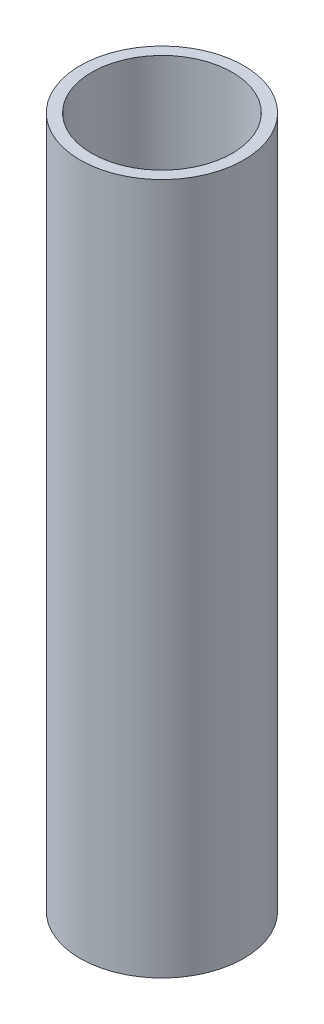
ISO-10303-21;
HEADER;
FILE_DESCRIPTION(('STEP AP214'),'2;1');
FILE_NAME('part.step','',(''),(''),'','','');
FILE_SCHEMA(('AUTOMOTIVE_DESIGN { 1 0 10303 214 1 1 1 1 }'));
ENDSEC;
DATA;
#1=APPLICATION_CONTEXT('core data for automotive mechanical design processes');
#2=APPLICATION_PROTOCOL_DEFINITION('international standard','automotive_design',2000,#1);
#3=PRODUCT_CONTEXT('',#1,'mechanical');
#4=PRODUCT('Part','Part','',(#3));
#5=PRODUCT_RELATED_PRODUCT_CATEGORY('part','',(#4));
#6=PRODUCT_DEFINITION_FORMATION('','',#4);
#7=PRODUCT_DEFINITION_CONTEXT('part definition',#1,'design');
#8=PRODUCT_DEFINITION('design','',#6,#7);
#9=PRODUCT_DEFINITION_SHAPE('','',#8);
#10=(LENGTH_UNIT() NAMED_UNIT(*) SI_UNIT(.MILLI.,.METRE.));
#11=(NAMED_UNIT(*) PLANE_ANGLE_UNIT() SI_UNIT($,.RADIAN.));
#12=(NAMED_UNIT(*) SI_UNIT($,.STERADIAN.) SOLID_ANGLE_UNIT());
#13=UNCERTAINTY_MEASURE_WITH_UNIT(LENGTH_MEASURE(1.E-05),#10,'distance_accuracy_value','');
#14=(GEOMETRIC_REPRESENTATION_CONTEXT(3) GLOBAL_UNCERTAINTY_ASSIGNED_CONTEXT((#13)) GLOBAL_UNIT_ASSIGNED_CONTEXT((#10,
#11,#12)) REPRESENTATION_CONTEXT('',''));
#15=CARTESIAN_POINT('',(0.,0.,0.));
#16=DIRECTION('',(0.,0.,1.));
#17=DIRECTION('',(1.,0.,0.));
#18=AXIS2_PLACEMENT_3D('',#15,#16,#17);
#19=CARTESIAN_POINT('',(0.,75.,0.));
#20=DIRECTION('',(0.,1.,0.));
#21=DIRECTION('',(0.,0.,1.));
#22=AXIS2_PLACEMENT_3D('',#19,#20,#21);
#23=PLANE('',#22);
#24=CARTESIAN_POINT('',(0.,75.,0.));
#25=DIRECTION('',(0.,1.,0.));
#26=DIRECTION('',(0.,0.,1.));
#27=AXIS2_PLACEMENT_3D('',#24,#25,#26);
#28=CIRCLE('',#27,8.875);
#29=CARTESIAN_POINT('',(0.,75.,8.875));
#30=VERTEX_POINT('',#29);
#31=EDGE_CURVE('E10',#30,#30,#28,.T.);
#32=ORIENTED_EDGE('',*,*,#31,.T.);
#33=EDGE_LOOP('',(#32));
#34=FACE_BOUND('',#33,.T.);
#35=CARTESIAN_POINT('',(0.,75.,0.));
#36=DIRECTION('',(0.,1.,0.));
#37=DIRECTION('',(0.,0.,1.));
#38=AXIS2_PLACEMENT_3D('',#35,#36,#37);
#39=CIRCLE('',#38,7.625);
#40=CARTESIAN_POINT('',(0.,75.,7.625));
#41=VERTEX_POINT('',#40);
#42=EDGE_CURVE('E42',#41,#41,#39,.T.);
#43=ORIENTED_EDGE('',*,*,#42,.F.);
#44=EDGE_LOOP('',(#43));
#45=FACE_BOUND('',#44,.T.);
#46=ADVANCED_FACE('F31',(#34,#45),#23,.T.);
#47=CARTESIAN_POINT('',(0.,0.,0.));
#48=DIRECTION('',(0.,1.,0.));
#49=DIRECTION('',(0.,0.,1.));
#50=AXIS2_PLACEMENT_3D('',#47,#48,#49);
#51=PLANE('',#50);
#52=CARTESIAN_POINT('',(0.,0.,0.));
#53=DIRECTION('',(0.,1.,0.));
#54=DIRECTION('',(0.,0.,1.));
#55=AXIS2_PLACEMENT_3D('',#52,#53,#54);
#56=CIRCLE('',#55,8.875);
#57=CARTESIAN_POINT('',(0.,0.,8.875));
#58=VERTEX_POINT('',#57);
#59=EDGE_CURVE('E35',#58,#58,#56,.T.);
#60=ORIENTED_EDGE('',*,*,#59,.F.);
#61=EDGE_LOOP('',(#60));
#62=FACE_BOUND('',#61,.T.);
#63=CARTESIAN_POINT('',(0.,0.,0.));
#64=DIRECTION('',(0.,1.,0.));
#65=DIRECTION('',(0.,0.,1.));
#66=AXIS2_PLACEMENT_3D('',#63,#64,#65);
#67=CIRCLE('',#66,7.625);
#68=CARTESIAN_POINT('',(0.,0.,7.625));
#69=VERTEX_POINT('',#68);
#70=EDGE_CURVE('E44',#69,#69,#67,.T.);
#71=ORIENTED_EDGE('',*,*,#70,.T.);
#72=EDGE_LOOP('',(#71));
#73=FACE_BOUND('',#72,.T.);
#74=ADVANCED_FACE('F54',(#62,#73),#51,.F.);
#75=CARTESIAN_POINT('',(0.,75.,0.));
#76=DIRECTION('',(0.,-1.,0.));
#77=DIRECTION('',(0.,0.,-1.));
#78=AXIS2_PLACEMENT_3D('',#75,#76,#77);
#79=CYLINDRICAL_SURFACE('',#78,8.875);
#80=ORIENTED_EDGE('',*,*,#31,.F.);
#81=EDGE_LOOP('',(#80));
#82=FACE_BOUND('',#81,.T.);
#83=ORIENTED_EDGE('',*,*,#59,.T.);
#84=EDGE_LOOP('',(#83));
#85=FACE_BOUND('',#84,.T.);
#86=ADVANCED_FACE('F33',(#82,#85),#79,.T.);
#87=CARTESIAN_POINT('',(0.,75.,0.));
#88=DIRECTION('',(0.,-1.,0.));
#89=DIRECTION('',(0.,0.,-1.));
#90=AXIS2_PLACEMENT_3D('',#87,#88,#89);
#91=CYLINDRICAL_SURFACE('',#90,7.625);
#92=ORIENTED_EDGE('',*,*,#42,.T.);
#93=EDGE_LOOP('',(#92));
#94=FACE_BOUND('',#93,.T.);
#95=ORIENTED_EDGE('',*,*,#70,.F.);
#96=EDGE_LOOP('',(#95));
#97=FACE_BOUND('',#96,.T.);
#98=ADVANCED_FACE('F50',(#94,#97),#91,.F.);
#99=CLOSED_SHELL('',(#46,#74,#86,#98));
#100=MANIFOLD_SOLID_BREP('B2',#99);
#101=ADVANCED_BREP_SHAPE_REPRESENTATION('',(#18,#100),#14);
#102=SHAPE_DEFINITION_REPRESENTATION(#9,#101);
ENDSEC;
END-ISO-10303-21;
